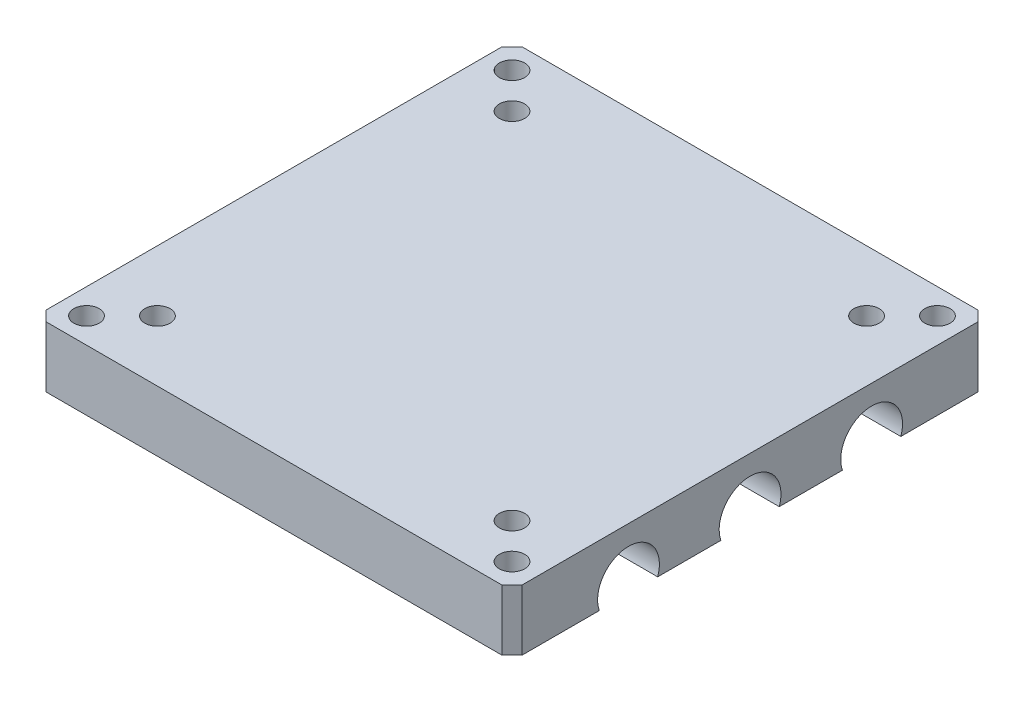
ISO-10303-21;
HEADER;
FILE_DESCRIPTION(('STEP AP214'),'2;1');
FILE_NAME('part.step','',(''),(''),'','','');
FILE_SCHEMA(('AUTOMOTIVE_DESIGN { 1 0 10303 214 1 1 1 1 }'));
ENDSEC;
DATA;
#1=APPLICATION_CONTEXT('core data for automotive mechanical design processes');
#2=APPLICATION_PROTOCOL_DEFINITION('international standard','automotive_design',2000,#1);
#3=PRODUCT_CONTEXT('',#1,'mechanical');
#4=PRODUCT('Part','Part','',(#3));
#5=PRODUCT_RELATED_PRODUCT_CATEGORY('part','',(#4));
#6=PRODUCT_DEFINITION_FORMATION('','',#4);
#7=PRODUCT_DEFINITION_CONTEXT('part definition',#1,'design');
#8=PRODUCT_DEFINITION('design','',#6,#7);
#9=PRODUCT_DEFINITION_SHAPE('','',#8);
#10=(LENGTH_UNIT() NAMED_UNIT(*) SI_UNIT(.MILLI.,.METRE.));
#11=(NAMED_UNIT(*) PLANE_ANGLE_UNIT() SI_UNIT($,.RADIAN.));
#12=(NAMED_UNIT(*) SI_UNIT($,.STERADIAN.) SOLID_ANGLE_UNIT());
#13=UNCERTAINTY_MEASURE_WITH_UNIT(LENGTH_MEASURE(1.E-05),#10,'distance_accuracy_value','');
#14=(GEOMETRIC_REPRESENTATION_CONTEXT(3) GLOBAL_UNCERTAINTY_ASSIGNED_CONTEXT((#13)) GLOBAL_UNIT_ASSIGNED_CONTEXT((#10,
#11,#12)) REPRESENTATION_CONTEXT('',''));
#15=CARTESIAN_POINT('',(0.,0.,0.));
#16=DIRECTION('',(0.,0.,1.));
#17=DIRECTION('',(1.,0.,0.));
#18=AXIS2_PLACEMENT_3D('',#15,#16,#17);
#19=CARTESIAN_POINT('',(-333.590216374017,5.00112533272013,-149.830525501));
#20=DIRECTION('',(-0.707106781186548,0.,0.707106781186548));
#21=DIRECTION('',(0.707106781186548,0.,0.707106781186548));
#22=AXIS2_PLACEMENT_3D('',#19,#20,#21);
#23=PLANE('',#22);
#24=DIRECTION('',(0.707106781186548,0.,0.707106781186548));
#25=VECTOR('',#24,1.);
#26=CARTESIAN_POINT('',(-333.590216374017,1.00112533272013,-149.830525501));
#27=LINE('',#26,#25);
#28=CARTESIAN_POINT('',(-333.590216374017,1.00112533272013,-149.830525501));
#29=VERTEX_POINT('',#28);
#30=CARTESIAN_POINT('',(-332.590216374017,1.00112533272014,-148.830525501));
#31=VERTEX_POINT('',#30);
#32=EDGE_CURVE('E242',#29,#31,#27,.T.);
#33=ORIENTED_EDGE('',*,*,#32,.F.);
#34=DIRECTION('',(0.,1.,0.));
#35=VECTOR('',#34,1.);
#36=CARTESIAN_POINT('',(-333.590216374017,5.00112533272013,-149.830525501));
#37=LINE('',#36,#35);
#38=CARTESIAN_POINT('',(-333.590216374017,7.00112533272013,-149.830525501));
#39=VERTEX_POINT('',#38);
#40=EDGE_CURVE('E260',#39,#29,#37,.F.);
#41=ORIENTED_EDGE('',*,*,#40,.F.);
#42=DIRECTION('',(0.707106781186548,0.,0.707106781186548));
#43=VECTOR('',#42,1.);
#44=CARTESIAN_POINT('',(-333.590216374017,7.00112533272013,-149.830525501));
#45=LINE('',#44,#43);
#46=CARTESIAN_POINT('',(-332.590216374017,7.00112533272013,-148.830525501));
#47=VERTEX_POINT('',#46);
#48=EDGE_CURVE('E278',#47,#39,#45,.F.);
#49=ORIENTED_EDGE('',*,*,#48,.F.);
#50=DIRECTION('',(0.,1.,0.));
#51=VECTOR('',#50,1.);
#52=CARTESIAN_POINT('',(-332.590216374017,5.00112533272017,-148.830525501));
#53=LINE('',#52,#51);
#54=EDGE_CURVE('E227',#31,#47,#53,.T.);
#55=ORIENTED_EDGE('',*,*,#54,.F.);
#56=EDGE_LOOP('',(#33,#41,#49,#55));
#57=FACE_BOUND('',#56,.T.);
#58=ADVANCED_FACE('F16',(#57),#23,.F.);
#59=CARTESIAN_POINT('',(-332.590216374017,5.00112533272017,-103.830525501));
#60=DIRECTION('',(-0.707106781186548,0.,-0.707106781186548));
#61=DIRECTION('',(-0.707106781186548,0.,0.707106781186548));
#62=AXIS2_PLACEMENT_3D('',#59,#60,#61);
#63=PLANE('',#62);
#64=DIRECTION('',(-0.707106781186552,0.,0.707106781186543));
#65=VECTOR('',#64,1.);
#66=CARTESIAN_POINT('',(-332.590216374017,1.00112533272017,-103.830525501));
#67=LINE('',#66,#65);
#68=CARTESIAN_POINT('',(-332.590216374017,1.00112533272017,-103.830525501));
#69=VERTEX_POINT('',#68);
#70=CARTESIAN_POINT('',(-333.590216374017,1.00112533272017,-102.830525501));
#71=VERTEX_POINT('',#70);
#72=EDGE_CURVE('E258',#69,#71,#67,.T.);
#73=ORIENTED_EDGE('',*,*,#72,.F.);
#74=DIRECTION('',(0.,1.,0.));
#75=VECTOR('',#74,1.);
#76=CARTESIAN_POINT('',(-332.590216374017,5.00112533272017,-103.830525501));
#77=LINE('',#76,#75);
#78=CARTESIAN_POINT('',(-332.590216374017,7.00112533272017,-103.830525501));
#79=VERTEX_POINT('',#78);
#80=EDGE_CURVE('E273',#79,#69,#77,.F.);
#81=ORIENTED_EDGE('',*,*,#80,.F.);
#82=DIRECTION('',(-0.707106781186548,0.,0.707106781186548));
#83=VECTOR('',#82,1.);
#84=CARTESIAN_POINT('',(-332.590216374017,7.00112533272017,-103.830525501));
#85=LINE('',#84,#83);
#86=CARTESIAN_POINT('',(-333.590216374017,7.00112533272017,-102.830525501));
#87=VERTEX_POINT('',#86);
#88=EDGE_CURVE('E269',#87,#79,#85,.F.);
#89=ORIENTED_EDGE('',*,*,#88,.F.);
#90=DIRECTION('',(0.,-1.,0.));
#91=VECTOR('',#90,1.);
#92=CARTESIAN_POINT('',(-333.590216374017,5.00112533272017,-102.830525501));
#93=LINE('',#92,#91);
#94=EDGE_CURVE('E149',#71,#87,#93,.F.);
#95=ORIENTED_EDGE('',*,*,#94,.F.);
#96=EDGE_LOOP('',(#73,#81,#89,#95));
#97=FACE_BOUND('',#96,.T.);
#98=ADVANCED_FACE('F575',(#97),#63,.F.);
#99=CARTESIAN_POINT('',(-323.590216374017,2.00112533272017,-126.330525501));
#100=DIRECTION('',(-1.,0.,0.));
#101=DIRECTION('',(0.,-1.,0.));
#102=AXIS2_PLACEMENT_3D('',#99,#100,#101);
#103=CYLINDRICAL_SURFACE('',#102,3.04999999999999);
#104=CARTESIAN_POINT('',(-379.590216374017,2.00112533272017,-126.330525501));
#105=DIRECTION('',(-1.,0.,0.));
#106=DIRECTION('',(0.,-1.,0.));
#107=AXIS2_PLACEMENT_3D('',#104,#105,#106);
#108=CIRCLE('',#107,3.04999999999999);
#109=CARTESIAN_POINT('',(-379.590216374017,1.00112533272016,-129.211931407845));
#110=VERTEX_POINT('',#109);
#111=CARTESIAN_POINT('',(-379.590216374017,1.00112533272016,-123.449119594155));
#112=VERTEX_POINT('',#111);
#113=EDGE_CURVE('E214',#110,#112,#108,.F.);
#114=ORIENTED_EDGE('',*,*,#113,.F.);
#115=DIRECTION('',(1.,0.,0.));
#116=VECTOR('',#115,1.);
#117=CARTESIAN_POINT('',(0.,1.00112533272015,-129.211931407845));
#118=LINE('',#117,#116);
#119=CARTESIAN_POINT('',(-332.590216374017,1.00112533272015,-129.211931407845));
#120=VERTEX_POINT('',#119);
#121=EDGE_CURVE('E238',#120,#110,#118,.F.);
#122=ORIENTED_EDGE('',*,*,#121,.F.);
#123=CARTESIAN_POINT('',(-332.590216374017,2.00112533272017,-126.330525501));
#124=DIRECTION('',(-1.,0.,0.));
#125=DIRECTION('',(0.,-1.,0.));
#126=AXIS2_PLACEMENT_3D('',#123,#124,#125);
#127=CIRCLE('',#126,3.04999999999999);
#128=CARTESIAN_POINT('',(-332.590216374017,1.00112533272015,-123.449119594155));
#129=VERTEX_POINT('',#128);
#130=EDGE_CURVE('E19',#129,#120,#127,.T.);
#131=ORIENTED_EDGE('',*,*,#130,.F.);
#132=DIRECTION('',(1.,0.,0.));
#133=VECTOR('',#132,1.);
#134=CARTESIAN_POINT('',(0.,1.00112533272015,-123.449119594155));
#135=LINE('',#134,#133);
#136=EDGE_CURVE('E94',#112,#129,#135,.T.);
#137=ORIENTED_EDGE('',*,*,#136,.F.);
#138=EDGE_LOOP('',(#114,#122,#131,#137));
#139=FACE_BOUND('',#138,.T.);
#140=ADVANCED_FACE('F354',(#139),#103,.F.);
#141=CARTESIAN_POINT('',(0.,1.00112533272026,0.));
#142=DIRECTION('',(0.,-1.,0.));
#143=DIRECTION('',(0.,0.,-1.));
#144=AXIS2_PLACEMENT_3D('',#141,#142,#143);
#145=PLANE('',#144);
#146=DIRECTION('',(-1.,0.,0.));
#147=VECTOR('',#146,1.);
#148=CARTESIAN_POINT('',(-323.590216374017,1.00112533272014,-117.211931407845));
#149=LINE('',#148,#147);
#150=CARTESIAN_POINT('',(-332.590216374017,1.00112533272014,-117.211931407845));
#151=VERTEX_POINT('',#150);
#152=CARTESIAN_POINT('',(-379.590216374017,1.00112533272015,-117.211931407845));
#153=VERTEX_POINT('',#152);
#154=EDGE_CURVE('E134',#151,#153,#149,.T.);
#155=ORIENTED_EDGE('',*,*,#154,.T.);
#156=DIRECTION('',(0.,0.,1.));
#157=VECTOR('',#156,1.);
#158=CARTESIAN_POINT('',(-379.590216374017,1.00112533272016,-102.830525501));
#159=LINE('',#158,#157);
#160=EDGE_CURVE('E213',#112,#153,#159,.T.);
#161=ORIENTED_EDGE('',*,*,#160,.F.);
#162=ORIENTED_EDGE('',*,*,#136,.T.);
#163=DIRECTION('',(0.,0.,1.));
#164=VECTOR('',#163,1.);
#165=CARTESIAN_POINT('',(-332.590216374017,1.00112533272015,-102.830525501));
#166=LINE('',#165,#164);
#167=EDGE_CURVE('E144',#151,#129,#166,.F.);
#168=ORIENTED_EDGE('',*,*,#167,.F.);
#169=EDGE_LOOP('',(#155,#161,#162,#168));
#170=FACE_BOUND('',#169,.T.);
#171=ADVANCED_FACE('F349',(#170),#145,.T.);
#172=CARTESIAN_POINT('',(-323.590216374017,2.00112533272014,-114.330525501));
#173=DIRECTION('',(-1.,0.,0.));
#174=DIRECTION('',(0.,-1.,0.));
#175=AXIS2_PLACEMENT_3D('',#172,#173,#174);
#176=CYLINDRICAL_SURFACE('',#175,3.04999999999999);
#177=CARTESIAN_POINT('',(-379.590216374017,2.00112533272014,-114.330525501));
#178=DIRECTION('',(-1.,0.,0.));
#179=DIRECTION('',(0.,-1.,0.));
#180=AXIS2_PLACEMENT_3D('',#177,#178,#179);
#181=CIRCLE('',#180,3.04999999999999);
#182=CARTESIAN_POINT('',(-379.590216374017,1.00112533272016,-111.449119594155));
#183=VERTEX_POINT('',#182);
#184=EDGE_CURVE('E210',#153,#183,#181,.F.);
#185=ORIENTED_EDGE('',*,*,#184,.F.);
#186=ORIENTED_EDGE('',*,*,#154,.F.);
#187=CARTESIAN_POINT('',(-332.590216374017,2.00112533272014,-114.330525501));
#188=DIRECTION('',(-1.,0.,0.));
#189=DIRECTION('',(0.,-1.,0.));
#190=AXIS2_PLACEMENT_3D('',#187,#188,#189);
#191=CIRCLE('',#190,3.04999999999999);
#192=CARTESIAN_POINT('',(-332.590216374017,1.00112533272017,-111.449119594155));
#193=VERTEX_POINT('',#192);
#194=EDGE_CURVE('E216',#193,#151,#191,.T.);
#195=ORIENTED_EDGE('',*,*,#194,.F.);
#196=DIRECTION('',(1.,0.,0.));
#197=VECTOR('',#196,1.);
#198=CARTESIAN_POINT('',(0.,1.00112533272017,-111.449119594155));
#199=LINE('',#198,#197);
#200=EDGE_CURVE('E256',#183,#193,#199,.T.);
#201=ORIENTED_EDGE('',*,*,#200,.F.);
#202=EDGE_LOOP('',(#185,#186,#195,#201));
#203=FACE_BOUND('',#202,.T.);
#204=ADVANCED_FACE('F348',(#203),#176,.F.);
#205=CARTESIAN_POINT('',(-378.590216374017,5.00112533272017,-102.830525501));
#206=DIRECTION('',(0.707106781186548,0.,-0.707106781186548));
#207=DIRECTION('',(-0.707106781186548,0.,-0.707106781186548));
#208=AXIS2_PLACEMENT_3D('',#205,#206,#207);
#209=PLANE('',#208);
#210=DIRECTION('',(-0.707106781186552,0.,-0.707106781186543));
#211=VECTOR('',#210,1.);
#212=CARTESIAN_POINT('',(-378.590216374017,1.00112533272017,-102.830525501));
#213=LINE('',#212,#211);
#214=CARTESIAN_POINT('',(-378.590216374017,1.00112533272017,-102.830525501));
#215=VERTEX_POINT('',#214);
#216=CARTESIAN_POINT('',(-379.590216374017,1.00112533272017,-103.830525501));
#217=VERTEX_POINT('',#216);
#218=EDGE_CURVE('E139',#215,#217,#213,.T.);
#219=ORIENTED_EDGE('',*,*,#218,.F.);
#220=DIRECTION('',(0.,-1.,0.));
#221=VECTOR('',#220,1.);
#222=CARTESIAN_POINT('',(-378.590216374017,5.00112533272017,-102.830525501));
#223=LINE('',#222,#221);
#224=CARTESIAN_POINT('',(-378.590216374017,7.00112533272017,-102.830525501));
#225=VERTEX_POINT('',#224);
#226=EDGE_CURVE('E137',#225,#215,#223,.T.);
#227=ORIENTED_EDGE('',*,*,#226,.F.);
#228=DIRECTION('',(-0.707106781186548,0.,-0.707106781186548));
#229=VECTOR('',#228,1.);
#230=CARTESIAN_POINT('',(-378.590216374017,7.00112533272017,-102.830525501));
#231=LINE('',#230,#229);
#232=CARTESIAN_POINT('',(-379.590216374017,7.00112533272017,-103.830525501));
#233=VERTEX_POINT('',#232);
#234=EDGE_CURVE('E124',#233,#225,#231,.F.);
#235=ORIENTED_EDGE('',*,*,#234,.F.);
#236=DIRECTION('',(0.,-1.,0.));
#237=VECTOR('',#236,1.);
#238=CARTESIAN_POINT('',(-379.590216374017,5.00112533272017,-103.830525501));
#239=LINE('',#238,#237);
#240=EDGE_CURVE('E248',#217,#233,#239,.F.);
#241=ORIENTED_EDGE('',*,*,#240,.F.);
#242=EDGE_LOOP('',(#219,#227,#235,#241));
#243=FACE_BOUND('',#242,.T.);
#244=ADVANCED_FACE('F138',(#243),#209,.F.);
#245=CARTESIAN_POINT('',(-379.590216374017,5.00112533272013,-148.830525501));
#246=DIRECTION('',(0.707106781186538,0.,0.707106781186557));
#247=DIRECTION('',(0.707106781186557,0.,-0.707106781186538));
#248=AXIS2_PLACEMENT_3D('',#245,#246,#247);
#249=PLANE('',#248);
#250=DIRECTION('',(0.707106781186557,0.,-0.707106781186538));
#251=VECTOR('',#250,1.);
#252=CARTESIAN_POINT('',(-379.590216374017,1.00112533272013,-148.830525501));
#253=LINE('',#252,#251);
#254=CARTESIAN_POINT('',(-379.590216374017,1.00112533272013,-148.830525501));
#255=VERTEX_POINT('',#254);
#256=CARTESIAN_POINT('',(-378.590216374017,1.00112533272013,-149.830525501));
#257=VERTEX_POINT('',#256);
#258=EDGE_CURVE('E103',#255,#257,#253,.T.);
#259=ORIENTED_EDGE('',*,*,#258,.F.);
#260=DIRECTION('',(0.,-1.,0.));
#261=VECTOR('',#260,1.);
#262=CARTESIAN_POINT('',(-379.590216374017,5.00112533272017,-148.830525501));
#263=LINE('',#262,#261);
#264=CARTESIAN_POINT('',(-379.590216374017,7.00112533272014,-148.830525501));
#265=VERTEX_POINT('',#264);
#266=EDGE_CURVE('E245',#265,#255,#263,.T.);
#267=ORIENTED_EDGE('',*,*,#266,.F.);
#268=DIRECTION('',(0.707106781186557,0.,-0.707106781186538));
#269=VECTOR('',#268,1.);
#270=CARTESIAN_POINT('',(-379.590216374017,7.00112533272013,-148.830525501));
#271=LINE('',#270,#269);
#272=CARTESIAN_POINT('',(-378.590216374017,7.00112533272013,-149.830525501));
#273=VERTEX_POINT('',#272);
#274=EDGE_CURVE('E34',#273,#265,#271,.F.);
#275=ORIENTED_EDGE('',*,*,#274,.F.);
#276=DIRECTION('',(0.,1.,0.));
#277=VECTOR('',#276,1.);
#278=CARTESIAN_POINT('',(-378.590216374017,5.00112533272013,-149.830525501));
#279=LINE('',#278,#277);
#280=EDGE_CURVE('E231',#257,#273,#279,.T.);
#281=ORIENTED_EDGE('',*,*,#280,.F.);
#282=EDGE_LOOP('',(#259,#267,#275,#281));
#283=FACE_BOUND('',#282,.T.);
#284=ADVANCED_FACE('F321',(#283),#249,.F.);
#285=CARTESIAN_POINT('',(-323.590216374017,2.00112533272014,-138.330525501));
#286=DIRECTION('',(-1.,0.,0.));
#287=DIRECTION('',(0.,-1.,0.));
#288=AXIS2_PLACEMENT_3D('',#285,#286,#287);
#289=CYLINDRICAL_SURFACE('',#288,3.04999999999999);
#290=CARTESIAN_POINT('',(-379.590216374017,2.00112533272014,-138.330525501));
#291=DIRECTION('',(-1.,0.,0.));
#292=DIRECTION('',(0.,-1.,0.));
#293=AXIS2_PLACEMENT_3D('',#290,#291,#292);
#294=CIRCLE('',#293,3.04999999999999);
#295=CARTESIAN_POINT('',(-379.590216374017,1.00112533272014,-141.211931407845));
#296=VERTEX_POINT('',#295);
#297=CARTESIAN_POINT('',(-379.590216374017,1.00112533272015,-135.449119594155));
#298=VERTEX_POINT('',#297);
#299=EDGE_CURVE('E207',#296,#298,#294,.F.);
#300=ORIENTED_EDGE('',*,*,#299,.F.);
#301=DIRECTION('',(1.,0.,0.));
#302=VECTOR('',#301,1.);
#303=CARTESIAN_POINT('',(0.,1.00112533272014,-141.211931407845));
#304=LINE('',#303,#302);
#305=CARTESIAN_POINT('',(-332.590216374017,1.00112533272014,-141.211931407845));
#306=VERTEX_POINT('',#305);
#307=EDGE_CURVE('E237',#306,#296,#304,.F.);
#308=ORIENTED_EDGE('',*,*,#307,.F.);
#309=CARTESIAN_POINT('',(-332.590216374017,2.00112533272014,-138.330525501));
#310=DIRECTION('',(-1.,0.,0.));
#311=DIRECTION('',(0.,-1.,0.));
#312=AXIS2_PLACEMENT_3D('',#309,#310,#311);
#313=CIRCLE('',#312,3.04999999999999);
#314=CARTESIAN_POINT('',(-332.590216374017,1.00112533272015,-135.449119594155));
#315=VERTEX_POINT('',#314);
#316=EDGE_CURVE('E219',#315,#306,#313,.T.);
#317=ORIENTED_EDGE('',*,*,#316,.F.);
#318=DIRECTION('',(1.,0.,0.));
#319=VECTOR('',#318,1.);
#320=CARTESIAN_POINT('',(0.,1.00112533272014,-135.449119594155));
#321=LINE('',#320,#319);
#322=EDGE_CURVE('E235',#298,#315,#321,.T.);
#323=ORIENTED_EDGE('',*,*,#322,.F.);
#324=EDGE_LOOP('',(#300,#308,#317,#323));
#325=FACE_BOUND('',#324,.T.);
#326=ADVANCED_FACE('F362',(#325),#289,.F.);
#327=CARTESIAN_POINT('',(0.,1.00112533272026,0.));
#328=DIRECTION('',(0.,-1.,0.));
#329=DIRECTION('',(0.,0.,-1.));
#330=AXIS2_PLACEMENT_3D('',#327,#328,#329);
#331=PLANE('',#330);
#332=ORIENTED_EDGE('',*,*,#322,.T.);
#333=DIRECTION('',(0.,0.,1.));
#334=VECTOR('',#333,1.);
#335=CARTESIAN_POINT('',(-332.590216374017,1.00112533272015,-102.830525501));
#336=LINE('',#335,#334);
#337=EDGE_CURVE('E221',#120,#315,#336,.F.);
#338=ORIENTED_EDGE('',*,*,#337,.F.);
#339=ORIENTED_EDGE('',*,*,#121,.T.);
#340=DIRECTION('',(0.,0.,1.));
#341=VECTOR('',#340,1.);
#342=CARTESIAN_POINT('',(-379.590216374017,1.00112533272016,-102.830525501));
#343=LINE('',#342,#341);
#344=EDGE_CURVE('E206',#298,#110,#343,.T.);
#345=ORIENTED_EDGE('',*,*,#344,.F.);
#346=EDGE_LOOP('',(#332,#338,#339,#345));
#347=FACE_BOUND('',#346,.T.);
#348=ADVANCED_FACE('F358',(#347),#331,.T.);
#349=CARTESIAN_POINT('',(0.,1.00112533272026,0.));
#350=DIRECTION('',(0.,-1.,0.));
#351=DIRECTION('',(0.,0.,-1.));
#352=AXIS2_PLACEMENT_3D('',#349,#350,#351);
#353=PLANE('',#352);
#354=CARTESIAN_POINT('',(-377.090216374017,1.00112533272013,-147.330525501));
#355=DIRECTION('',(0.,-1.,0.));
#356=DIRECTION('',(0.,0.,-1.));
#357=AXIS2_PLACEMENT_3D('',#354,#355,#356);
#358=CIRCLE('',#357,1.24999999999995);
#359=CARTESIAN_POINT('',(-377.090216374017,1.00112533272013,-148.580525501));
#360=VERTEX_POINT('',#359);
#361=EDGE_CURVE('E188',#360,#360,#358,.F.);
#362=ORIENTED_EDGE('',*,*,#361,.T.);
#363=EDGE_LOOP('',(#362));
#364=FACE_BOUND('',#363,.T.);
#365=CARTESIAN_POINT('',(-335.090216374017,1.00112533272013,-147.330525501));
#366=DIRECTION('',(0.,-1.,0.));
#367=DIRECTION('',(0.,0.,-1.));
#368=AXIS2_PLACEMENT_3D('',#365,#366,#367);
#369=CIRCLE('',#368,1.24999999999995);
#370=CARTESIAN_POINT('',(-335.090216374017,1.00112533272013,-148.580525501));
#371=VERTEX_POINT('',#370);
#372=EDGE_CURVE('E191',#371,#371,#369,.F.);
#373=ORIENTED_EDGE('',*,*,#372,.T.);
#374=EDGE_LOOP('',(#373));
#375=FACE_BOUND('',#374,.T.);
#376=CARTESIAN_POINT('',(-373.590216374017,1.00112533272014,-143.830525501));
#377=DIRECTION('',(0.,-1.,0.));
#378=DIRECTION('',(0.,0.,-1.));
#379=AXIS2_PLACEMENT_3D('',#376,#377,#378);
#380=CIRCLE('',#379,1.24999999999995);
#381=CARTESIAN_POINT('',(-373.590216374017,1.00112533272014,-145.080525501));
#382=VERTEX_POINT('',#381);
#383=EDGE_CURVE('E194',#382,#382,#380,.F.);
#384=ORIENTED_EDGE('',*,*,#383,.T.);
#385=EDGE_LOOP('',(#384));
#386=FACE_BOUND('',#385,.T.);
#387=CARTESIAN_POINT('',(-338.590216374017,1.00112533272014,-143.830525501));
#388=DIRECTION('',(0.,-1.,0.));
#389=DIRECTION('',(0.,0.,-1.));
#390=AXIS2_PLACEMENT_3D('',#387,#388,#389);
#391=CIRCLE('',#390,1.24999999999995);
#392=CARTESIAN_POINT('',(-338.590216374017,1.00112533272014,-145.080525501));
#393=VERTEX_POINT('',#392);
#394=EDGE_CURVE('E197',#393,#393,#391,.F.);
#395=ORIENTED_EDGE('',*,*,#394,.T.);
#396=EDGE_LOOP('',(#395));
#397=FACE_BOUND('',#396,.T.);
#398=ORIENTED_EDGE('',*,*,#32,.T.);
#399=DIRECTION('',(0.,0.,1.));
#400=VECTOR('',#399,1.);
#401=CARTESIAN_POINT('',(-332.590216374017,1.00112533272015,-102.830525501));
#402=LINE('',#401,#400);
#403=EDGE_CURVE('E220',#306,#31,#402,.F.);
#404=ORIENTED_EDGE('',*,*,#403,.F.);
#405=ORIENTED_EDGE('',*,*,#307,.T.);
#406=DIRECTION('',(0.,0.,1.));
#407=VECTOR('',#406,1.);
#408=CARTESIAN_POINT('',(-379.590216374017,1.00112533272013,-102.830525501));
#409=LINE('',#408,#407);
#410=EDGE_CURVE('E209',#255,#296,#409,.T.);
#411=ORIENTED_EDGE('',*,*,#410,.F.);
#412=ORIENTED_EDGE('',*,*,#258,.T.);
#413=DIRECTION('',(1.,0.,0.));
#414=VECTOR('',#413,1.);
#415=CARTESIAN_POINT('',(-379.590216374017,1.00112533272013,-149.830525501));
#416=LINE('',#415,#414);
#417=EDGE_CURVE('E300',#29,#257,#416,.F.);
#418=ORIENTED_EDGE('',*,*,#417,.F.);
#419=EDGE_LOOP('',(#398,#404,#405,#411,#412,#418));
#420=FACE_BOUND('',#419,.T.);
#421=ADVANCED_FACE('F319',(#364,#375,#386,#397,#420),#353,.T.);
#422=CARTESIAN_POINT('',(0.,1.00112533272026,0.));
#423=DIRECTION('',(0.,-1.,0.));
#424=DIRECTION('',(0.,0.,-1.));
#425=AXIS2_PLACEMENT_3D('',#422,#423,#424);
#426=PLANE('',#425);
#427=CARTESIAN_POINT('',(-335.090216374017,1.00112533272017,-105.330525501));
#428=DIRECTION('',(0.,-1.,0.));
#429=DIRECTION('',(0.,0.,-1.));
#430=AXIS2_PLACEMENT_3D('',#427,#428,#429);
#431=CIRCLE('',#430,1.24999999999996);
#432=CARTESIAN_POINT('',(-335.090216374017,1.00112533272017,-106.580525501));
#433=VERTEX_POINT('',#432);
#434=EDGE_CURVE('E182',#433,#433,#431,.F.);
#435=ORIENTED_EDGE('',*,*,#434,.T.);
#436=EDGE_LOOP('',(#435));
#437=FACE_BOUND('',#436,.T.);
#438=CARTESIAN_POINT('',(-377.090216374017,1.00112533272017,-105.330525501));
#439=DIRECTION('',(0.,-1.,0.));
#440=DIRECTION('',(0.,0.,-1.));
#441=AXIS2_PLACEMENT_3D('',#438,#439,#440);
#442=CIRCLE('',#441,1.24999999999996);
#443=CARTESIAN_POINT('',(-377.090216374017,1.00112533272017,-106.580525501));
#444=VERTEX_POINT('',#443);
#445=EDGE_CURVE('E185',#444,#444,#442,.F.);
#446=ORIENTED_EDGE('',*,*,#445,.T.);
#447=EDGE_LOOP('',(#446));
#448=FACE_BOUND('',#447,.T.);
#449=CARTESIAN_POINT('',(-338.590216374017,1.00112533272017,-108.830525501));
#450=DIRECTION('',(0.,-1.,0.));
#451=DIRECTION('',(0.,0.,-1.));
#452=AXIS2_PLACEMENT_3D('',#449,#450,#451);
#453=CIRCLE('',#452,1.24999999999996);
#454=CARTESIAN_POINT('',(-338.590216374017,1.00112533272017,-110.080525501));
#455=VERTEX_POINT('',#454);
#456=EDGE_CURVE('E200',#455,#455,#453,.F.);
#457=ORIENTED_EDGE('',*,*,#456,.T.);
#458=EDGE_LOOP('',(#457));
#459=FACE_BOUND('',#458,.T.);
#460=CARTESIAN_POINT('',(-373.590216374017,1.00112533272017,-108.830525501));
#461=DIRECTION('',(0.,-1.,0.));
#462=DIRECTION('',(0.,0.,-1.));
#463=AXIS2_PLACEMENT_3D('',#460,#461,#462);
#464=CIRCLE('',#463,1.24999999999996);
#465=CARTESIAN_POINT('',(-373.590216374017,1.00112533272017,-110.080525501));
#466=VERTEX_POINT('',#465);
#467=EDGE_CURVE('E203',#466,#466,#464,.F.);
#468=ORIENTED_EDGE('',*,*,#467,.T.);
#469=EDGE_LOOP('',(#468));
#470=FACE_BOUND('',#469,.T.);
#471=ORIENTED_EDGE('',*,*,#218,.T.);
#472=DIRECTION('',(0.,0.,1.));
#473=VECTOR('',#472,1.);
#474=CARTESIAN_POINT('',(-379.590216374017,1.00112533272016,-102.830525501));
#475=LINE('',#474,#473);
#476=EDGE_CURVE('E212',#183,#217,#475,.T.);
#477=ORIENTED_EDGE('',*,*,#476,.F.);
#478=ORIENTED_EDGE('',*,*,#200,.T.);
#479=DIRECTION('',(0.,0.,1.));
#480=VECTOR('',#479,1.);
#481=CARTESIAN_POINT('',(-332.590216374017,1.00112533272017,-102.830525501));
#482=LINE('',#481,#480);
#483=EDGE_CURVE('E218',#69,#193,#482,.F.);
#484=ORIENTED_EDGE('',*,*,#483,.F.);
#485=ORIENTED_EDGE('',*,*,#72,.T.);
#486=DIRECTION('',(1.,0.,0.));
#487=VECTOR('',#486,1.);
#488=CARTESIAN_POINT('',(-379.590216374017,1.00112533272017,-102.830525501));
#489=LINE('',#488,#487);
#490=EDGE_CURVE('E143',#215,#71,#489,.T.);
#491=ORIENTED_EDGE('',*,*,#490,.F.);
#492=EDGE_LOOP('',(#471,#477,#478,#484,#485,#491));
#493=FACE_BOUND('',#492,.T.);
#494=ADVANCED_FACE('F421',(#437,#448,#459,#470,#493),#426,.T.);
#495=CARTESIAN_POINT('',(-379.590216374017,5.00112533272013,-149.830525501));
#496=DIRECTION('',(0.,0.,-1.));
#497=DIRECTION('',(0.,1.,0.));
#498=AXIS2_PLACEMENT_3D('',#495,#496,#497);
#499=PLANE('',#498);
#500=ORIENTED_EDGE('',*,*,#417,.T.);
#501=ORIENTED_EDGE('',*,*,#280,.T.);
#502=DIRECTION('',(1.,0.,0.));
#503=VECTOR('',#502,1.);
#504=CARTESIAN_POINT('',(0.,7.00112533272013,-149.830525501));
#505=LINE('',#504,#503);
#506=EDGE_CURVE('E155',#273,#39,#505,.T.);
#507=ORIENTED_EDGE('',*,*,#506,.T.);
#508=ORIENTED_EDGE('',*,*,#40,.T.);
#509=EDGE_LOOP('',(#500,#501,#507,#508));
#510=FACE_BOUND('',#509,.T.);
#511=ADVANCED_FACE('F311',(#510),#499,.T.);
#512=CARTESIAN_POINT('',(-332.590216374017,5.00112533272017,-102.830525501));
#513=DIRECTION('',(1.,0.,0.));
#514=DIRECTION('',(0.,1.,0.));
#515=AXIS2_PLACEMENT_3D('',#512,#513,#514);
#516=PLANE('',#515);
#517=ORIENTED_EDGE('',*,*,#194,.T.);
#518=ORIENTED_EDGE('',*,*,#167,.T.);
#519=ORIENTED_EDGE('',*,*,#130,.T.);
#520=ORIENTED_EDGE('',*,*,#337,.T.);
#521=ORIENTED_EDGE('',*,*,#316,.T.);
#522=ORIENTED_EDGE('',*,*,#403,.T.);
#523=ORIENTED_EDGE('',*,*,#54,.T.);
#524=DIRECTION('',(0.,0.,-1.));
#525=VECTOR('',#524,1.);
#526=CARTESIAN_POINT('',(-332.590216374017,7.00112533272026,0.));
#527=LINE('',#526,#525);
#528=EDGE_CURVE('E150',#47,#79,#527,.F.);
#529=ORIENTED_EDGE('',*,*,#528,.T.);
#530=ORIENTED_EDGE('',*,*,#80,.T.);
#531=ORIENTED_EDGE('',*,*,#483,.T.);
#532=EDGE_LOOP('',(#517,#518,#519,#520,#521,#522,#523,#529,#530,#531));
#533=FACE_BOUND('',#532,.T.);
#534=ADVANCED_FACE('F344',(#533),#516,.T.);
#535=CARTESIAN_POINT('',(-379.590216374017,5.00112533272017,-102.830525501));
#536=DIRECTION('',(0.,0.,1.));
#537=DIRECTION('',(0.,-1.,0.));
#538=AXIS2_PLACEMENT_3D('',#535,#536,#537);
#539=PLANE('',#538);
#540=ORIENTED_EDGE('',*,*,#490,.T.);
#541=ORIENTED_EDGE('',*,*,#94,.T.);
#542=DIRECTION('',(1.,0.,0.));
#543=VECTOR('',#542,1.);
#544=CARTESIAN_POINT('',(0.,7.00112533272017,-102.830525501));
#545=LINE('',#544,#543);
#546=EDGE_CURVE('E128',#87,#225,#545,.F.);
#547=ORIENTED_EDGE('',*,*,#546,.T.);
#548=ORIENTED_EDGE('',*,*,#226,.T.);
#549=EDGE_LOOP('',(#540,#541,#547,#548));
#550=FACE_BOUND('',#549,.T.);
#551=ADVANCED_FACE('F147',(#550),#539,.T.);
#552=CARTESIAN_POINT('',(-379.590216374017,5.00112533272017,-102.830525501));
#553=DIRECTION('',(-1.,0.,0.));
#554=DIRECTION('',(0.,-1.,0.));
#555=AXIS2_PLACEMENT_3D('',#552,#553,#554);
#556=PLANE('',#555);
#557=ORIENTED_EDGE('',*,*,#299,.T.);
#558=ORIENTED_EDGE('',*,*,#344,.T.);
#559=ORIENTED_EDGE('',*,*,#113,.T.);
#560=ORIENTED_EDGE('',*,*,#160,.T.);
#561=ORIENTED_EDGE('',*,*,#184,.T.);
#562=ORIENTED_EDGE('',*,*,#476,.T.);
#563=ORIENTED_EDGE('',*,*,#240,.T.);
#564=DIRECTION('',(0.,0.,-1.));
#565=VECTOR('',#564,1.);
#566=CARTESIAN_POINT('',(-379.590216374017,7.00112533272026,0.));
#567=LINE('',#566,#565);
#568=EDGE_CURVE('E130',#233,#265,#567,.T.);
#569=ORIENTED_EDGE('',*,*,#568,.T.);
#570=ORIENTED_EDGE('',*,*,#266,.T.);
#571=ORIENTED_EDGE('',*,*,#410,.T.);
#572=EDGE_LOOP('',(#557,#558,#559,#560,#561,#562,#563,#569,#570,#571));
#573=FACE_BOUND('',#572,.T.);
#574=ADVANCED_FACE('F324',(#573),#556,.T.);
#575=CARTESIAN_POINT('',(-373.590216374017,5.00112533272017,-108.830525501));
#576=DIRECTION('',(0.,-1.,0.));
#577=DIRECTION('',(0.,0.,-1.));
#578=AXIS2_PLACEMENT_3D('',#575,#576,#577);
#579=CYLINDRICAL_SURFACE('',#578,1.24999999999996);
#580=CARTESIAN_POINT('',(-373.590216374017,7.00112533272017,-108.830525501));
#581=DIRECTION('',(0.,-1.,0.));
#582=DIRECTION('',(0.,0.,-1.));
#583=AXIS2_PLACEMENT_3D('',#580,#581,#582);
#584=CIRCLE('',#583,1.24999999999996);
#585=CARTESIAN_POINT('',(-373.590216374017,7.00112533272017,-110.080525501));
#586=VERTEX_POINT('',#585);
#587=EDGE_CURVE('E152',#586,#586,#584,.F.);
#588=ORIENTED_EDGE('',*,*,#587,.T.);
#589=EDGE_LOOP('',(#588));
#590=FACE_BOUND('',#589,.T.);
#591=ORIENTED_EDGE('',*,*,#467,.F.);
#592=EDGE_LOOP('',(#591));
#593=FACE_BOUND('',#592,.T.);
#594=ADVANCED_FACE('F408',(#590,#593),#579,.F.);
#595=CARTESIAN_POINT('',(-338.590216374017,5.00112533272017,-108.830525501));
#596=DIRECTION('',(0.,-1.,0.));
#597=DIRECTION('',(0.,0.,-1.));
#598=AXIS2_PLACEMENT_3D('',#595,#596,#597);
#599=CYLINDRICAL_SURFACE('',#598,1.24999999999996);
#600=CARTESIAN_POINT('',(-338.590216374017,7.00112533272017,-108.830525501));
#601=DIRECTION('',(0.,-1.,0.));
#602=DIRECTION('',(0.,0.,-1.));
#603=AXIS2_PLACEMENT_3D('',#600,#601,#602);
#604=CIRCLE('',#603,1.24999999999996);
#605=CARTESIAN_POINT('',(-338.590216374017,7.00112533272017,-110.080525501));
#606=VERTEX_POINT('',#605);
#607=EDGE_CURVE('E177',#606,#606,#604,.F.);
#608=ORIENTED_EDGE('',*,*,#607,.T.);
#609=EDGE_LOOP('',(#608));
#610=FACE_BOUND('',#609,.T.);
#611=ORIENTED_EDGE('',*,*,#456,.F.);
#612=EDGE_LOOP('',(#611));
#613=FACE_BOUND('',#612,.T.);
#614=ADVANCED_FACE('F404',(#610,#613),#599,.F.);
#615=CARTESIAN_POINT('',(-338.590216374017,5.00112533272014,-143.830525501));
#616=DIRECTION('',(0.,-1.,0.));
#617=DIRECTION('',(0.,0.,-1.));
#618=AXIS2_PLACEMENT_3D('',#615,#616,#617);
#619=CYLINDRICAL_SURFACE('',#618,1.24999999999995);
#620=CARTESIAN_POINT('',(-338.590216374017,7.00112533272014,-143.830525501));
#621=DIRECTION('',(0.,-1.,0.));
#622=DIRECTION('',(0.,0.,-1.));
#623=AXIS2_PLACEMENT_3D('',#620,#621,#622);
#624=CIRCLE('',#623,1.24999999999995);
#625=CARTESIAN_POINT('',(-338.590216374017,7.00112533272014,-145.080525501));
#626=VERTEX_POINT('',#625);
#627=EDGE_CURVE('E174',#626,#626,#624,.F.);
#628=ORIENTED_EDGE('',*,*,#627,.T.);
#629=EDGE_LOOP('',(#628));
#630=FACE_BOUND('',#629,.T.);
#631=ORIENTED_EDGE('',*,*,#394,.F.);
#632=EDGE_LOOP('',(#631));
#633=FACE_BOUND('',#632,.T.);
#634=ADVANCED_FACE('F400',(#630,#633),#619,.F.);
#635=CARTESIAN_POINT('',(-373.590216374017,5.00112533272014,-143.830525501));
#636=DIRECTION('',(0.,-1.,0.));
#637=DIRECTION('',(0.,0.,-1.));
#638=AXIS2_PLACEMENT_3D('',#635,#636,#637);
#639=CYLINDRICAL_SURFACE('',#638,1.24999999999995);
#640=CARTESIAN_POINT('',(-373.590216374017,7.00112533272014,-143.830525501));
#641=DIRECTION('',(0.,-1.,0.));
#642=DIRECTION('',(0.,0.,-1.));
#643=AXIS2_PLACEMENT_3D('',#640,#641,#642);
#644=CIRCLE('',#643,1.24999999999995);
#645=CARTESIAN_POINT('',(-373.590216374017,7.00112533272014,-145.080525501));
#646=VERTEX_POINT('',#645);
#647=EDGE_CURVE('E171',#646,#646,#644,.F.);
#648=ORIENTED_EDGE('',*,*,#647,.T.);
#649=EDGE_LOOP('',(#648));
#650=FACE_BOUND('',#649,.T.);
#651=ORIENTED_EDGE('',*,*,#383,.F.);
#652=EDGE_LOOP('',(#651));
#653=FACE_BOUND('',#652,.T.);
#654=ADVANCED_FACE('F396',(#650,#653),#639,.F.);
#655=CARTESIAN_POINT('',(-335.090216374017,5.00112533272014,-147.330525501));
#656=DIRECTION('',(0.,-1.,0.));
#657=DIRECTION('',(0.,0.,-1.));
#658=AXIS2_PLACEMENT_3D('',#655,#656,#657);
#659=CYLINDRICAL_SURFACE('',#658,1.24999999999995);
#660=CARTESIAN_POINT('',(-335.090216374017,7.00112533272014,-147.330525501));
#661=DIRECTION('',(0.,-1.,0.));
#662=DIRECTION('',(0.,0.,-1.));
#663=AXIS2_PLACEMENT_3D('',#660,#661,#662);
#664=CIRCLE('',#663,1.24999999999995);
#665=CARTESIAN_POINT('',(-335.090216374017,7.00112533272013,-148.580525501));
#666=VERTEX_POINT('',#665);
#667=EDGE_CURVE('E168',#666,#666,#664,.F.);
#668=ORIENTED_EDGE('',*,*,#667,.T.);
#669=EDGE_LOOP('',(#668));
#670=FACE_BOUND('',#669,.T.);
#671=ORIENTED_EDGE('',*,*,#372,.F.);
#672=EDGE_LOOP('',(#671));
#673=FACE_BOUND('',#672,.T.);
#674=ADVANCED_FACE('F392',(#670,#673),#659,.F.);
#675=CARTESIAN_POINT('',(-377.090216374017,5.00112533272014,-147.330525501));
#676=DIRECTION('',(0.,-1.,0.));
#677=DIRECTION('',(0.,0.,-1.));
#678=AXIS2_PLACEMENT_3D('',#675,#676,#677);
#679=CYLINDRICAL_SURFACE('',#678,1.24999999999995);
#680=CARTESIAN_POINT('',(-377.090216374017,7.00112533272014,-147.330525501));
#681=DIRECTION('',(0.,-1.,0.));
#682=DIRECTION('',(0.,0.,-1.));
#683=AXIS2_PLACEMENT_3D('',#680,#681,#682);
#684=CIRCLE('',#683,1.24999999999995);
#685=CARTESIAN_POINT('',(-377.090216374017,7.00112533272013,-148.580525501));
#686=VERTEX_POINT('',#685);
#687=EDGE_CURVE('E165',#686,#686,#684,.F.);
#688=ORIENTED_EDGE('',*,*,#687,.T.);
#689=EDGE_LOOP('',(#688));
#690=FACE_BOUND('',#689,.T.);
#691=ORIENTED_EDGE('',*,*,#361,.F.);
#692=EDGE_LOOP('',(#691));
#693=FACE_BOUND('',#692,.T.);
#694=ADVANCED_FACE('F388',(#690,#693),#679,.F.);
#695=CARTESIAN_POINT('',(-377.090216374017,5.00112533272017,-105.330525501));
#696=DIRECTION('',(0.,-1.,0.));
#697=DIRECTION('',(0.,0.,-1.));
#698=AXIS2_PLACEMENT_3D('',#695,#696,#697);
#699=CYLINDRICAL_SURFACE('',#698,1.24999999999996);
#700=CARTESIAN_POINT('',(-377.090216374017,7.00112533272017,-105.330525501));
#701=DIRECTION('',(0.,-1.,0.));
#702=DIRECTION('',(0.,0.,-1.));
#703=AXIS2_PLACEMENT_3D('',#700,#701,#702);
#704=CIRCLE('',#703,1.24999999999996);
#705=CARTESIAN_POINT('',(-377.090216374017,7.00112533272017,-106.580525501));
#706=VERTEX_POINT('',#705);
#707=EDGE_CURVE('E25',#706,#706,#704,.F.);
#708=ORIENTED_EDGE('',*,*,#707,.T.);
#709=EDGE_LOOP('',(#708));
#710=FACE_BOUND('',#709,.T.);
#711=ORIENTED_EDGE('',*,*,#445,.F.);
#712=EDGE_LOOP('',(#711));
#713=FACE_BOUND('',#712,.T.);
#714=ADVANCED_FACE('F380',(#710,#713),#699,.F.);
#715=CARTESIAN_POINT('',(-335.090216374017,5.00112533272017,-105.330525501));
#716=DIRECTION('',(0.,-1.,0.));
#717=DIRECTION('',(0.,0.,-1.));
#718=AXIS2_PLACEMENT_3D('',#715,#716,#717);
#719=CYLINDRICAL_SURFACE('',#718,1.24999999999996);
#720=CARTESIAN_POINT('',(-335.090216374017,7.00112533272017,-105.330525501));
#721=DIRECTION('',(0.,-1.,0.));
#722=DIRECTION('',(0.,0.,-1.));
#723=AXIS2_PLACEMENT_3D('',#720,#721,#722);
#724=CIRCLE('',#723,1.24999999999996);
#725=CARTESIAN_POINT('',(-335.090216374017,7.00112533272017,-106.580525501));
#726=VERTEX_POINT('',#725);
#727=EDGE_CURVE('E11',#726,#726,#724,.F.);
#728=ORIENTED_EDGE('',*,*,#727,.T.);
#729=EDGE_LOOP('',(#728));
#730=FACE_BOUND('',#729,.T.);
#731=ORIENTED_EDGE('',*,*,#434,.F.);
#732=EDGE_LOOP('',(#731));
#733=FACE_BOUND('',#732,.T.);
#734=ADVANCED_FACE('F374',(#730,#733),#719,.F.);
#735=CARTESIAN_POINT('',(0.,7.00112533272026,0.));
#736=DIRECTION('',(0.,-1.,0.));
#737=DIRECTION('',(0.,0.,-1.));
#738=AXIS2_PLACEMENT_3D('',#735,#736,#737);
#739=PLANE('',#738);
#740=ORIENTED_EDGE('',*,*,#727,.F.);
#741=EDGE_LOOP('',(#740));
#742=FACE_BOUND('',#741,.T.);
#743=ORIENTED_EDGE('',*,*,#707,.F.);
#744=EDGE_LOOP('',(#743));
#745=FACE_BOUND('',#744,.T.);
#746=ORIENTED_EDGE('',*,*,#687,.F.);
#747=EDGE_LOOP('',(#746));
#748=FACE_BOUND('',#747,.T.);
#749=ORIENTED_EDGE('',*,*,#667,.F.);
#750=EDGE_LOOP('',(#749));
#751=FACE_BOUND('',#750,.T.);
#752=ORIENTED_EDGE('',*,*,#647,.F.);
#753=EDGE_LOOP('',(#752));
#754=FACE_BOUND('',#753,.T.);
#755=ORIENTED_EDGE('',*,*,#627,.F.);
#756=EDGE_LOOP('',(#755));
#757=FACE_BOUND('',#756,.T.);
#758=ORIENTED_EDGE('',*,*,#607,.F.);
#759=EDGE_LOOP('',(#758));
#760=FACE_BOUND('',#759,.T.);
#761=ORIENTED_EDGE('',*,*,#587,.F.);
#762=EDGE_LOOP('',(#761));
#763=FACE_BOUND('',#762,.T.);
#764=ORIENTED_EDGE('',*,*,#568,.F.);
#765=ORIENTED_EDGE('',*,*,#234,.T.);
#766=ORIENTED_EDGE('',*,*,#546,.F.);
#767=ORIENTED_EDGE('',*,*,#88,.T.);
#768=ORIENTED_EDGE('',*,*,#528,.F.);
#769=ORIENTED_EDGE('',*,*,#48,.T.);
#770=ORIENTED_EDGE('',*,*,#506,.F.);
#771=ORIENTED_EDGE('',*,*,#274,.T.);
#772=EDGE_LOOP('',(#764,#765,#766,#767,#768,#769,#770,#771));
#773=FACE_BOUND('',#772,.T.);
#774=ADVANCED_FACE('F126',(#742,#745,#748,#751,#754,#757,#760,#763,#773),#739,.F.);
#775=CLOSED_SHELL('',(#58,#98,#140,#171,#204,#244,#284,#326,#348,#421,#494,#511,#534,#551,#574,
#594,#614,#634,#654,#674,#694,#714,#734,#774));
#776=MANIFOLD_SOLID_BREP('B1',#775);
#777=ADVANCED_BREP_SHAPE_REPRESENTATION('',(#18,#776),#14);
#778=SHAPE_DEFINITION_REPRESENTATION(#9,#777);
ENDSEC;
END-ISO-10303-21;
